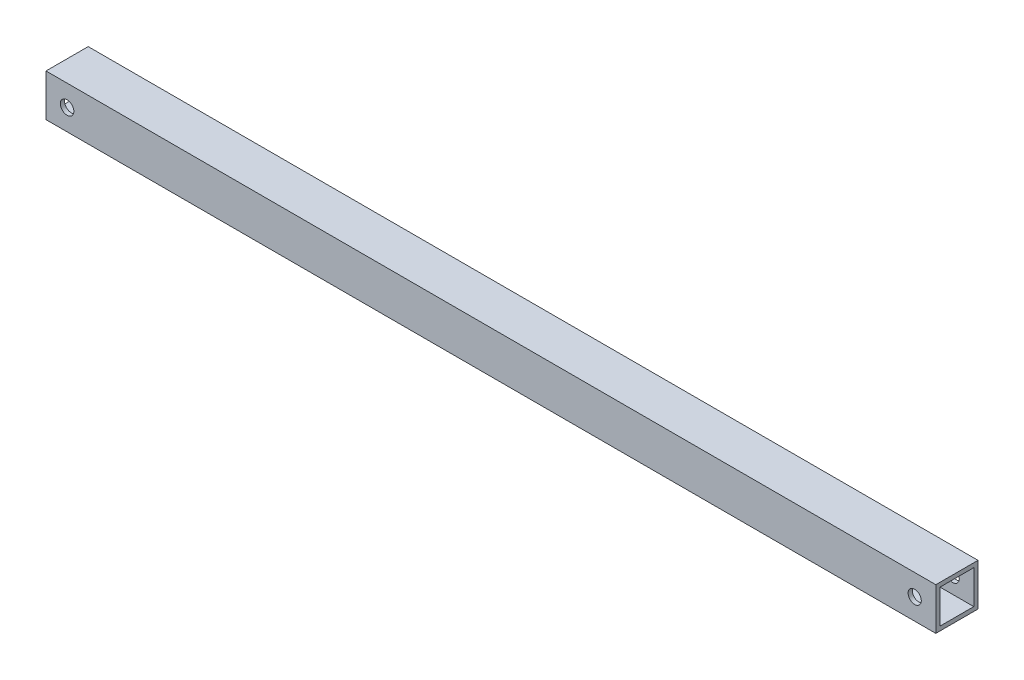
ISO-10303-21;
HEADER;
FILE_DESCRIPTION(('STEP AP214'),'2;1');
FILE_NAME('part.step','',(''),(''),'','','');
FILE_SCHEMA(('AUTOMOTIVE_DESIGN { 1 0 10303 214 1 1 1 1 }'));
ENDSEC;
DATA;
#1=APPLICATION_CONTEXT('core data for automotive mechanical design processes');
#2=APPLICATION_PROTOCOL_DEFINITION('international standard','automotive_design',2000,#1);
#3=PRODUCT_CONTEXT('',#1,'mechanical');
#4=PRODUCT('Part','Part','',(#3));
#5=PRODUCT_RELATED_PRODUCT_CATEGORY('part','',(#4));
#6=PRODUCT_DEFINITION_FORMATION('','',#4);
#7=PRODUCT_DEFINITION_CONTEXT('part definition',#1,'design');
#8=PRODUCT_DEFINITION('design','',#6,#7);
#9=PRODUCT_DEFINITION_SHAPE('','',#8);
#10=(LENGTH_UNIT() NAMED_UNIT(*) SI_UNIT(.MILLI.,.METRE.));
#11=(NAMED_UNIT(*) PLANE_ANGLE_UNIT() SI_UNIT($,.RADIAN.));
#12=(NAMED_UNIT(*) SI_UNIT($,.STERADIAN.) SOLID_ANGLE_UNIT());
#13=UNCERTAINTY_MEASURE_WITH_UNIT(LENGTH_MEASURE(1.E-05),#10,'distance_accuracy_value','');
#14=(GEOMETRIC_REPRESENTATION_CONTEXT(3) GLOBAL_UNCERTAINTY_ASSIGNED_CONTEXT((#13)) GLOBAL_UNIT_ASSIGNED_CONTEXT((#10,
#11,#12)) REPRESENTATION_CONTEXT('',''));
#15=CARTESIAN_POINT('',(0.,0.,0.));
#16=DIRECTION('',(0.,0.,1.));
#17=DIRECTION('',(1.,0.,0.));
#18=AXIS2_PLACEMENT_3D('',#15,#16,#17);
#19=CARTESIAN_POINT('',(-567.294734194972,455.000000000004,10.));
#20=DIRECTION('',(0.,0.,-1.));
#21=DIRECTION('',(-1.,0.,0.));
#22=AXIS2_PLACEMENT_3D('',#19,#20,#21);
#23=CYLINDRICAL_SURFACE('',#22,1.60000000000002);
#24=CARTESIAN_POINT('',(-567.294734194972,455.000000000004,0.999999999999999));
#25=DIRECTION('',(0.,0.,-1.));
#26=DIRECTION('',(-1.,0.,0.));
#27=AXIS2_PLACEMENT_3D('',#24,#25,#26);
#28=CIRCLE('',#27,1.60000000000002);
#29=CARTESIAN_POINT('',(-568.894734194972,455.000000000004,0.999999999999999));
#30=VERTEX_POINT('',#29);
#31=EDGE_CURVE('E139',#30,#30,#28,.T.);
#32=ORIENTED_EDGE('',*,*,#31,.F.);
#33=EDGE_LOOP('',(#32));
#34=FACE_BOUND('',#33,.T.);
#35=CARTESIAN_POINT('',(-567.294734194972,455.000000000004,0.));
#36=DIRECTION('',(0.,0.,1.));
#37=DIRECTION('',(1.,0.,0.));
#38=AXIS2_PLACEMENT_3D('',#35,#36,#37);
#39=CIRCLE('',#38,1.60000000000002);
#40=CARTESIAN_POINT('',(-565.694734194972,455.000000000004,0.));
#41=VERTEX_POINT('',#40);
#42=EDGE_CURVE('E146',#41,#41,#39,.T.);
#43=ORIENTED_EDGE('',*,*,#42,.F.);
#44=EDGE_LOOP('',(#43));
#45=FACE_BOUND('',#44,.T.);
#46=ADVANCED_FACE('F33',(#34,#45),#23,.F.);
#47=CARTESIAN_POINT('',(-366.39518190463,454.995481814786,10.));
#48=DIRECTION('',(0.,0.,-1.));
#49=DIRECTION('',(-1.,0.,0.));
#50=AXIS2_PLACEMENT_3D('',#47,#48,#49);
#51=CYLINDRICAL_SURFACE('',#50,1.55979576745022);
#52=CARTESIAN_POINT('',(-366.39518190463,454.995481814786,0.999999999999999));
#53=DIRECTION('',(0.,0.,-1.));
#54=DIRECTION('',(-1.,0.,0.));
#55=AXIS2_PLACEMENT_3D('',#52,#53,#54);
#56=CIRCLE('',#55,1.55979576745022);
#57=CARTESIAN_POINT('',(-367.95497767208,454.995481814786,0.999999999999999));
#58=VERTEX_POINT('',#57);
#59=EDGE_CURVE('E37',#58,#58,#56,.T.);
#60=ORIENTED_EDGE('',*,*,#59,.F.);
#61=EDGE_LOOP('',(#60));
#62=FACE_BOUND('',#61,.T.);
#63=CARTESIAN_POINT('',(-366.39518190463,454.995481814786,0.));
#64=DIRECTION('',(0.,0.,1.));
#65=DIRECTION('',(1.,0.,0.));
#66=AXIS2_PLACEMENT_3D('',#63,#64,#65);
#67=CIRCLE('',#66,1.55979576745022);
#68=CARTESIAN_POINT('',(-364.83538613718,454.995481814786,0.));
#69=VERTEX_POINT('',#68);
#70=EDGE_CURVE('E142',#69,#69,#67,.T.);
#71=ORIENTED_EDGE('',*,*,#70,.F.);
#72=EDGE_LOOP('',(#71));
#73=FACE_BOUND('',#72,.T.);
#74=ADVANCED_FACE('F189',(#62,#73),#51,.F.);
#75=CARTESIAN_POINT('',(0.,0.,10.));
#76=DIRECTION('',(0.,0.,1.));
#77=DIRECTION('',(1.,0.,0.));
#78=AXIS2_PLACEMENT_3D('',#75,#76,#77);
#79=PLANE('',#78);
#80=CARTESIAN_POINT('',(-567.294734194972,455.000000000004,10.));
#81=DIRECTION('',(0.,0.,1.));
#82=DIRECTION('',(1.,0.,0.));
#83=AXIS2_PLACEMENT_3D('',#80,#81,#82);
#84=CIRCLE('',#83,1.60000000000002);
#85=CARTESIAN_POINT('',(-565.694734194972,455.000000000004,10.));
#86=VERTEX_POINT('',#85);
#87=EDGE_CURVE('E149',#86,#86,#84,.T.);
#88=ORIENTED_EDGE('',*,*,#87,.F.);
#89=EDGE_LOOP('',(#88));
#90=FACE_BOUND('',#89,.T.);
#91=DIRECTION('',(0.,1.,0.));
#92=VECTOR('',#91,1.);
#93=CARTESIAN_POINT('',(-361.39518190463,450.000000000004,10.));
#94=LINE('',#93,#92);
#95=CARTESIAN_POINT('',(-361.39518190463,450.000000000004,10.));
#96=VERTEX_POINT('',#95);
#97=CARTESIAN_POINT('',(-361.39518190463,460.000000000004,10.));
#98=VERTEX_POINT('',#97);
#99=EDGE_CURVE('E155',#96,#98,#94,.T.);
#100=ORIENTED_EDGE('',*,*,#99,.T.);
#101=DIRECTION('',(-1.,0.,0.));
#102=VECTOR('',#101,1.);
#103=CARTESIAN_POINT('',(-361.39518190463,460.000000000004,10.));
#104=LINE('',#103,#102);
#105=CARTESIAN_POINT('',(-572.294734194972,460.000000000004,10.));
#106=VERTEX_POINT('',#105);
#107=EDGE_CURVE('E158',#98,#106,#104,.T.);
#108=ORIENTED_EDGE('',*,*,#107,.T.);
#109=DIRECTION('',(0.,-1.,0.));
#110=VECTOR('',#109,1.);
#111=CARTESIAN_POINT('',(-572.294734194972,450.000000000004,10.));
#112=LINE('',#111,#110);
#113=CARTESIAN_POINT('',(-572.294734194972,450.000000000004,10.));
#114=VERTEX_POINT('',#113);
#115=EDGE_CURVE('E161',#106,#114,#112,.T.);
#116=ORIENTED_EDGE('',*,*,#115,.T.);
#117=DIRECTION('',(1.,0.,0.));
#118=VECTOR('',#117,1.);
#119=CARTESIAN_POINT('',(-361.39518190463,450.000000000004,10.));
#120=LINE('',#119,#118);
#121=EDGE_CURVE('E163',#114,#96,#120,.T.);
#122=ORIENTED_EDGE('',*,*,#121,.T.);
#123=EDGE_LOOP('',(#100,#108,#116,#122));
#124=FACE_BOUND('',#123,.T.);
#125=CARTESIAN_POINT('',(-366.39518190463,454.995481814786,10.));
#126=DIRECTION('',(0.,0.,1.));
#127=DIRECTION('',(1.,0.,0.));
#128=AXIS2_PLACEMENT_3D('',#125,#126,#127);
#129=CIRCLE('',#128,1.55979576745022);
#130=CARTESIAN_POINT('',(-364.83538613718,454.995481814786,10.));
#131=VERTEX_POINT('',#130);
#132=EDGE_CURVE('E143',#131,#131,#129,.T.);
#133=ORIENTED_EDGE('',*,*,#132,.F.);
#134=EDGE_LOOP('',(#133));
#135=FACE_BOUND('',#134,.T.);
#136=ADVANCED_FACE('F192',(#90,#124,#135),#79,.T.);
#137=CARTESIAN_POINT('',(0.,0.,0.));
#138=DIRECTION('',(0.,0.,1.));
#139=DIRECTION('',(1.,0.,0.));
#140=AXIS2_PLACEMENT_3D('',#137,#138,#139);
#141=PLANE('',#140);
#142=DIRECTION('',(0.,1.,0.));
#143=VECTOR('',#142,1.);
#144=CARTESIAN_POINT('',(-361.39518190463,450.000000000004,0.));
#145=LINE('',#144,#143);
#146=CARTESIAN_POINT('',(-361.39518190463,450.000000000004,0.));
#147=VERTEX_POINT('',#146);
#148=CARTESIAN_POINT('',(-361.39518190463,460.000000000004,0.));
#149=VERTEX_POINT('',#148);
#150=EDGE_CURVE('E152',#147,#149,#145,.T.);
#151=ORIENTED_EDGE('',*,*,#150,.F.);
#152=DIRECTION('',(1.,0.,0.));
#153=VECTOR('',#152,1.);
#154=CARTESIAN_POINT('',(-361.39518190463,450.000000000004,0.));
#155=LINE('',#154,#153);
#156=CARTESIAN_POINT('',(-572.294734194972,450.000000000004,0.));
#157=VERTEX_POINT('',#156);
#158=EDGE_CURVE('E159',#157,#147,#155,.T.);
#159=ORIENTED_EDGE('',*,*,#158,.F.);
#160=DIRECTION('',(0.,-1.,0.));
#161=VECTOR('',#160,1.);
#162=CARTESIAN_POINT('',(-572.294734194972,450.000000000004,0.));
#163=LINE('',#162,#161);
#164=CARTESIAN_POINT('',(-572.294734194972,460.000000000004,0.));
#165=VERTEX_POINT('',#164);
#166=EDGE_CURVE('E170',#165,#157,#163,.T.);
#167=ORIENTED_EDGE('',*,*,#166,.F.);
#168=DIRECTION('',(-1.,0.,0.));
#169=VECTOR('',#168,1.);
#170=CARTESIAN_POINT('',(-361.39518190463,460.000000000004,0.));
#171=LINE('',#170,#169);
#172=EDGE_CURVE('E168',#149,#165,#171,.T.);
#173=ORIENTED_EDGE('',*,*,#172,.F.);
#174=EDGE_LOOP('',(#151,#159,#167,#173));
#175=FACE_BOUND('',#174,.T.);
#176=ORIENTED_EDGE('',*,*,#42,.T.);
#177=EDGE_LOOP('',(#176));
#178=FACE_BOUND('',#177,.T.);
#179=ORIENTED_EDGE('',*,*,#70,.T.);
#180=EDGE_LOOP('',(#179));
#181=FACE_BOUND('',#180,.T.);
#182=ADVANCED_FACE('F194',(#175,#178,#181),#141,.F.);
#183=CARTESIAN_POINT('',(-361.39518190463,450.000000000004,10.));
#184=DIRECTION('',(-1.,0.,0.));
#185=DIRECTION('',(0.,0.,1.));
#186=AXIS2_PLACEMENT_3D('',#183,#184,#185);
#187=PLANE('',#186);
#188=DIRECTION('',(0.,0.,-1.));
#189=VECTOR('',#188,1.);
#190=CARTESIAN_POINT('',(-361.39518190463,459.,1.));
#191=LINE('',#190,#189);
#192=CARTESIAN_POINT('',(-361.39518190463,459.,9.));
#193=VERTEX_POINT('',#192);
#194=CARTESIAN_POINT('',(-361.39518190463,459.,1.));
#195=VERTEX_POINT('',#194);
#196=EDGE_CURVE('E108',#193,#195,#191,.T.);
#197=ORIENTED_EDGE('',*,*,#196,.T.);
#198=DIRECTION('',(0.,-1.,0.));
#199=VECTOR('',#198,1.);
#200=CARTESIAN_POINT('',(-361.39518190463,451.,1.));
#201=LINE('',#200,#199);
#202=CARTESIAN_POINT('',(-361.39518190463,451.,1.));
#203=VERTEX_POINT('',#202);
#204=EDGE_CURVE('E102',#195,#203,#201,.T.);
#205=ORIENTED_EDGE('',*,*,#204,.T.);
#206=DIRECTION('',(0.,0.,1.));
#207=VECTOR('',#206,1.);
#208=CARTESIAN_POINT('',(-361.39518190463,451.,1.));
#209=LINE('',#208,#207);
#210=CARTESIAN_POINT('',(-361.39518190463,451.,9.));
#211=VERTEX_POINT('',#210);
#212=EDGE_CURVE('E111',#203,#211,#209,.T.);
#213=ORIENTED_EDGE('',*,*,#212,.T.);
#214=DIRECTION('',(0.,1.,0.));
#215=VECTOR('',#214,1.);
#216=CARTESIAN_POINT('',(-361.39518190463,451.,9.));
#217=LINE('',#216,#215);
#218=EDGE_CURVE('E50',#211,#193,#217,.T.);
#219=ORIENTED_EDGE('',*,*,#218,.T.);
#220=EDGE_LOOP('',(#197,#205,#213,#219));
#221=FACE_BOUND('',#220,.T.);
#222=ORIENTED_EDGE('',*,*,#150,.T.);
#223=DIRECTION('',(0.,0.,-1.));
#224=VECTOR('',#223,1.);
#225=CARTESIAN_POINT('',(-361.39518190463,460.000000000004,10.));
#226=LINE('',#225,#224);
#227=EDGE_CURVE('E11',#98,#149,#226,.T.);
#228=ORIENTED_EDGE('',*,*,#227,.F.);
#229=ORIENTED_EDGE('',*,*,#99,.F.);
#230=DIRECTION('',(0.,0.,-1.));
#231=VECTOR('',#230,1.);
#232=CARTESIAN_POINT('',(-361.39518190463,450.000000000004,10.));
#233=LINE('',#232,#231);
#234=EDGE_CURVE('E165',#96,#147,#233,.T.);
#235=ORIENTED_EDGE('',*,*,#234,.T.);
#236=EDGE_LOOP('',(#222,#228,#229,#235));
#237=FACE_BOUND('',#236,.T.);
#238=ADVANCED_FACE('F35',(#221,#237),#187,.F.);
#239=CARTESIAN_POINT('',(-361.39518190463,460.000000000004,10.));
#240=DIRECTION('',(0.,-1.,0.));
#241=DIRECTION('',(0.,0.,-1.));
#242=AXIS2_PLACEMENT_3D('',#239,#240,#241);
#243=PLANE('',#242);
#244=ORIENTED_EDGE('',*,*,#172,.T.);
#245=DIRECTION('',(0.,0.,-1.));
#246=VECTOR('',#245,1.);
#247=CARTESIAN_POINT('',(-572.294734194972,460.000000000004,10.));
#248=LINE('',#247,#246);
#249=EDGE_CURVE('E42',#106,#165,#248,.T.);
#250=ORIENTED_EDGE('',*,*,#249,.F.);
#251=ORIENTED_EDGE('',*,*,#107,.F.);
#252=ORIENTED_EDGE('',*,*,#227,.T.);
#253=EDGE_LOOP('',(#244,#250,#251,#252));
#254=FACE_BOUND('',#253,.T.);
#255=ADVANCED_FACE('F298',(#254),#243,.F.);
#256=CARTESIAN_POINT('',(-572.294734194972,450.000000000004,10.));
#257=DIRECTION('',(1.,0.,0.));
#258=DIRECTION('',(0.,0.,-1.));
#259=AXIS2_PLACEMENT_3D('',#256,#257,#258);
#260=PLANE('',#259);
#261=DIRECTION('',(0.,0.,1.));
#262=VECTOR('',#261,1.);
#263=CARTESIAN_POINT('',(-572.294734194972,451.,1.));
#264=LINE('',#263,#262);
#265=CARTESIAN_POINT('',(-572.294734194972,451.,0.999999999999999));
#266=VERTEX_POINT('',#265);
#267=CARTESIAN_POINT('',(-572.294734194972,451.,9.));
#268=VERTEX_POINT('',#267);
#269=EDGE_CURVE('E126',#266,#268,#264,.T.);
#270=ORIENTED_EDGE('',*,*,#269,.F.);
#271=DIRECTION('',(0.,-1.,0.));
#272=VECTOR('',#271,1.);
#273=CARTESIAN_POINT('',(-572.294734194972,451.,1.));
#274=LINE('',#273,#272);
#275=CARTESIAN_POINT('',(-572.294734194972,459.,1.));
#276=VERTEX_POINT('',#275);
#277=EDGE_CURVE('E58',#276,#266,#274,.T.);
#278=ORIENTED_EDGE('',*,*,#277,.F.);
#279=DIRECTION('',(0.,0.,-1.));
#280=VECTOR('',#279,1.);
#281=CARTESIAN_POINT('',(-572.294734194972,459.,1.));
#282=LINE('',#281,#280);
#283=CARTESIAN_POINT('',(-572.294734194972,459.,9.));
#284=VERTEX_POINT('',#283);
#285=EDGE_CURVE('E117',#284,#276,#282,.T.);
#286=ORIENTED_EDGE('',*,*,#285,.F.);
#287=DIRECTION('',(0.,1.,0.));
#288=VECTOR('',#287,1.);
#289=CARTESIAN_POINT('',(-572.294734194972,451.,9.));
#290=LINE('',#289,#288);
#291=EDGE_CURVE('E120',#268,#284,#290,.T.);
#292=ORIENTED_EDGE('',*,*,#291,.F.);
#293=EDGE_LOOP('',(#270,#278,#286,#292));
#294=FACE_BOUND('',#293,.T.);
#295=ORIENTED_EDGE('',*,*,#166,.T.);
#296=DIRECTION('',(0.,0.,-1.));
#297=VECTOR('',#296,1.);
#298=CARTESIAN_POINT('',(-572.294734194972,450.000000000004,10.));
#299=LINE('',#298,#297);
#300=EDGE_CURVE('E175',#114,#157,#299,.T.);
#301=ORIENTED_EDGE('',*,*,#300,.F.);
#302=ORIENTED_EDGE('',*,*,#115,.F.);
#303=ORIENTED_EDGE('',*,*,#249,.T.);
#304=EDGE_LOOP('',(#295,#301,#302,#303));
#305=FACE_BOUND('',#304,.T.);
#306=ADVANCED_FACE('F219',(#294,#305),#260,.F.);
#307=CARTESIAN_POINT('',(-361.39518190463,450.000000000004,10.));
#308=DIRECTION('',(0.,1.,0.));
#309=DIRECTION('',(0.,0.,1.));
#310=AXIS2_PLACEMENT_3D('',#307,#308,#309);
#311=PLANE('',#310);
#312=ORIENTED_EDGE('',*,*,#158,.T.);
#313=ORIENTED_EDGE('',*,*,#234,.F.);
#314=ORIENTED_EDGE('',*,*,#121,.F.);
#315=ORIENTED_EDGE('',*,*,#300,.T.);
#316=EDGE_LOOP('',(#312,#313,#314,#315));
#317=FACE_BOUND('',#316,.T.);
#318=ADVANCED_FACE('F214',(#317),#311,.F.);
#319=CARTESIAN_POINT('',(-567.294734194972,455.000000000004,9.));
#320=DIRECTION('',(0.,0.,1.));
#321=DIRECTION('',(1.,0.,0.));
#322=AXIS2_PLACEMENT_3D('',#319,#320,#321);
#323=CIRCLE('',#322,1.60000000000002);
#324=CARTESIAN_POINT('',(-565.694734194972,455.000000000004,9.));
#325=VERTEX_POINT('',#324);
#326=EDGE_CURVE('E136',#325,#325,#323,.T.);
#327=ORIENTED_EDGE('',*,*,#326,.F.);
#328=EDGE_LOOP('',(#327));
#329=FACE_BOUND('',#328,.T.);
#330=ORIENTED_EDGE('',*,*,#87,.T.);
#331=EDGE_LOOP('',(#330));
#332=FACE_BOUND('',#331,.T.);
#333=ADVANCED_FACE('F187',(#329,#332),#23,.F.);
#334=CARTESIAN_POINT('',(-366.39518190463,454.995481814786,9.));
#335=DIRECTION('',(0.,0.,1.));
#336=DIRECTION('',(1.,0.,0.));
#337=AXIS2_PLACEMENT_3D('',#334,#335,#336);
#338=CIRCLE('',#337,1.55979576745022);
#339=CARTESIAN_POINT('',(-364.83538613718,454.995481814786,9.));
#340=VERTEX_POINT('',#339);
#341=EDGE_CURVE('E132',#340,#340,#338,.T.);
#342=ORIENTED_EDGE('',*,*,#341,.F.);
#343=EDGE_LOOP('',(#342));
#344=FACE_BOUND('',#343,.T.);
#345=ORIENTED_EDGE('',*,*,#132,.T.);
#346=EDGE_LOOP('',(#345));
#347=FACE_BOUND('',#346,.T.);
#348=ADVANCED_FACE('F184',(#344,#347),#51,.F.);
#349=CARTESIAN_POINT('',(-361.39518190463,451.,1.));
#350=DIRECTION('',(0.,0.,-1.));
#351=DIRECTION('',(-1.,0.,0.));
#352=AXIS2_PLACEMENT_3D('',#349,#350,#351);
#353=PLANE('',#352);
#354=ORIENTED_EDGE('',*,*,#31,.T.);
#355=EDGE_LOOP('',(#354));
#356=FACE_BOUND('',#355,.T.);
#357=ORIENTED_EDGE('',*,*,#59,.T.);
#358=EDGE_LOOP('',(#357));
#359=FACE_BOUND('',#358,.T.);
#360=ORIENTED_EDGE('',*,*,#277,.T.);
#361=DIRECTION('',(-1.,0.,0.));
#362=VECTOR('',#361,1.);
#363=CARTESIAN_POINT('',(-361.39518190463,451.,1.));
#364=LINE('',#363,#362);
#365=EDGE_CURVE('E98',#203,#266,#364,.T.);
#366=ORIENTED_EDGE('',*,*,#365,.F.);
#367=ORIENTED_EDGE('',*,*,#204,.F.);
#368=DIRECTION('',(-1.,0.,0.));
#369=VECTOR('',#368,1.);
#370=CARTESIAN_POINT('',(-361.39518190463,459.,1.));
#371=LINE('',#370,#369);
#372=EDGE_CURVE('E130',#195,#276,#371,.T.);
#373=ORIENTED_EDGE('',*,*,#372,.T.);
#374=EDGE_LOOP('',(#360,#366,#367,#373));
#375=FACE_BOUND('',#374,.T.);
#376=ADVANCED_FACE('F100',(#356,#359,#375),#353,.F.);
#377=CARTESIAN_POINT('',(-361.39518190463,459.,1.));
#378=DIRECTION('',(0.,1.,0.));
#379=DIRECTION('',(0.,0.,1.));
#380=AXIS2_PLACEMENT_3D('',#377,#378,#379);
#381=PLANE('',#380);
#382=ORIENTED_EDGE('',*,*,#285,.T.);
#383=ORIENTED_EDGE('',*,*,#372,.F.);
#384=ORIENTED_EDGE('',*,*,#196,.F.);
#385=DIRECTION('',(-1.,0.,0.));
#386=VECTOR('',#385,1.);
#387=CARTESIAN_POINT('',(-361.39518190463,459.,9.));
#388=LINE('',#387,#386);
#389=EDGE_CURVE('E133',#193,#284,#388,.T.);
#390=ORIENTED_EDGE('',*,*,#389,.T.);
#391=EDGE_LOOP('',(#382,#383,#384,#390));
#392=FACE_BOUND('',#391,.T.);
#393=ADVANCED_FACE('F226',(#392),#381,.F.);
#394=CARTESIAN_POINT('',(-361.39518190463,451.,9.));
#395=DIRECTION('',(0.,0.,1.));
#396=DIRECTION('',(1.,0.,0.));
#397=AXIS2_PLACEMENT_3D('',#394,#395,#396);
#398=PLANE('',#397);
#399=ORIENTED_EDGE('',*,*,#326,.T.);
#400=EDGE_LOOP('',(#399));
#401=FACE_BOUND('',#400,.T.);
#402=ORIENTED_EDGE('',*,*,#341,.T.);
#403=EDGE_LOOP('',(#402));
#404=FACE_BOUND('',#403,.T.);
#405=ORIENTED_EDGE('',*,*,#291,.T.);
#406=ORIENTED_EDGE('',*,*,#389,.F.);
#407=ORIENTED_EDGE('',*,*,#218,.F.);
#408=DIRECTION('',(-1.,0.,0.));
#409=VECTOR('',#408,1.);
#410=CARTESIAN_POINT('',(-361.39518190463,451.,9.));
#411=LINE('',#410,#409);
#412=EDGE_CURVE('E107',#211,#268,#411,.T.);
#413=ORIENTED_EDGE('',*,*,#412,.T.);
#414=EDGE_LOOP('',(#405,#406,#407,#413));
#415=FACE_BOUND('',#414,.T.);
#416=ADVANCED_FACE('F182',(#401,#404,#415),#398,.F.);
#417=CARTESIAN_POINT('',(-361.39518190463,451.,1.));
#418=DIRECTION('',(0.,-1.,0.));
#419=DIRECTION('',(0.,0.,-1.));
#420=AXIS2_PLACEMENT_3D('',#417,#418,#419);
#421=PLANE('',#420);
#422=ORIENTED_EDGE('',*,*,#269,.T.);
#423=ORIENTED_EDGE('',*,*,#412,.F.);
#424=ORIENTED_EDGE('',*,*,#212,.F.);
#425=ORIENTED_EDGE('',*,*,#365,.T.);
#426=EDGE_LOOP('',(#422,#423,#424,#425));
#427=FACE_BOUND('',#426,.T.);
#428=ADVANCED_FACE('F112',(#427),#421,.F.);
#429=CLOSED_SHELL('',(#46,#74,#136,#182,#238,#255,#306,#318,#333,#348,#376,#393,#416,#428));
#430=MANIFOLD_SOLID_BREP('B2',#429);
#431=ADVANCED_BREP_SHAPE_REPRESENTATION('',(#18,#430),#14);
#432=SHAPE_DEFINITION_REPRESENTATION(#9,#431);
ENDSEC;
END-ISO-10303-21;
